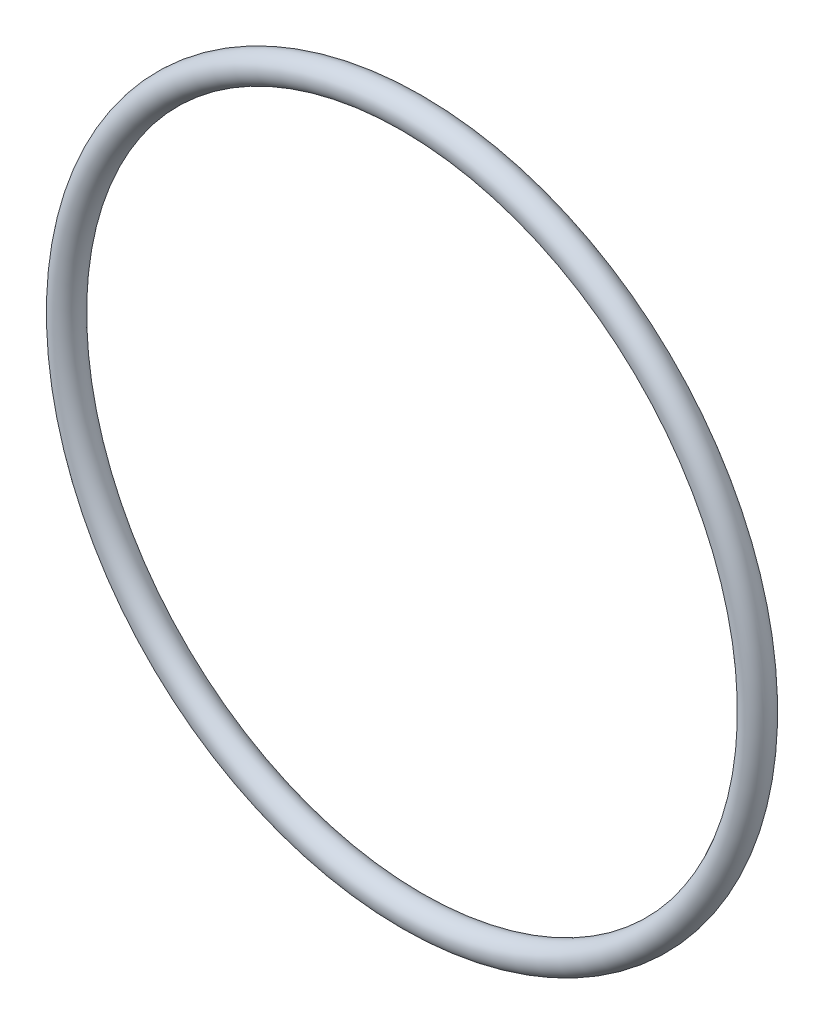
ISO-10303-21;
HEADER;
FILE_DESCRIPTION(('STEP AP214'),'2;1');
FILE_NAME('part.step','',(''),(''),'','','');
FILE_SCHEMA(('AUTOMOTIVE_DESIGN { 1 0 10303 214 1 1 1 1 }'));
ENDSEC;
DATA;
#1=APPLICATION_CONTEXT('core data for automotive mechanical design processes');
#2=APPLICATION_PROTOCOL_DEFINITION('international standard','automotive_design',2000,#1);
#3=PRODUCT_CONTEXT('',#1,'mechanical');
#4=PRODUCT('Part','Part','',(#3));
#5=PRODUCT_RELATED_PRODUCT_CATEGORY('part','',(#4));
#6=PRODUCT_DEFINITION_FORMATION('','',#4);
#7=PRODUCT_DEFINITION_CONTEXT('part definition',#1,'design');
#8=PRODUCT_DEFINITION('design','',#6,#7);
#9=PRODUCT_DEFINITION_SHAPE('','',#8);
#10=(LENGTH_UNIT() NAMED_UNIT(*) SI_UNIT(.MILLI.,.METRE.));
#11=(NAMED_UNIT(*) PLANE_ANGLE_UNIT() SI_UNIT($,.RADIAN.));
#12=(NAMED_UNIT(*) SI_UNIT($,.STERADIAN.) SOLID_ANGLE_UNIT());
#13=UNCERTAINTY_MEASURE_WITH_UNIT(LENGTH_MEASURE(1.E-05),#10,'distance_accuracy_value','');
#14=(GEOMETRIC_REPRESENTATION_CONTEXT(3) GLOBAL_UNCERTAINTY_ASSIGNED_CONTEXT((#13)) GLOBAL_UNIT_ASSIGNED_CONTEXT((#10,
#11,#12)) REPRESENTATION_CONTEXT('',''));
#15=CARTESIAN_POINT('',(0.,0.,0.));
#16=DIRECTION('',(0.,0.,1.));
#17=DIRECTION('',(1.,0.,0.));
#18=AXIS2_PLACEMENT_3D('',#15,#16,#17);
#19=CARTESIAN_POINT('',(0.,0.,0.));
#20=DIRECTION('',(0.,0.,1.));
#21=DIRECTION('',(0.,-1.,0.));
#22=AXIS2_PLACEMENT_3D('',#19,#20,#21);
#23=TOROIDAL_SURFACE('',#22,42.8371,1.7653);
#24=CARTESIAN_POINT('',(0.,-44.6024,0.));
#25=VERTEX_POINT('',#24);
#26=VERTEX_LOOP('',#25);
#27=FACE_BOUND('',#26,.T.);
#28=ADVANCED_FACE('F41',(#27),#23,.T.);
#29=CLOSED_SHELL('',(#28));
#30=MANIFOLD_SOLID_BREP('B2',#29);
#31=ADVANCED_BREP_SHAPE_REPRESENTATION('',(#18,#30),#14);
#32=SHAPE_DEFINITION_REPRESENTATION(#9,#31);
ENDSEC;
END-ISO-10303-21;
